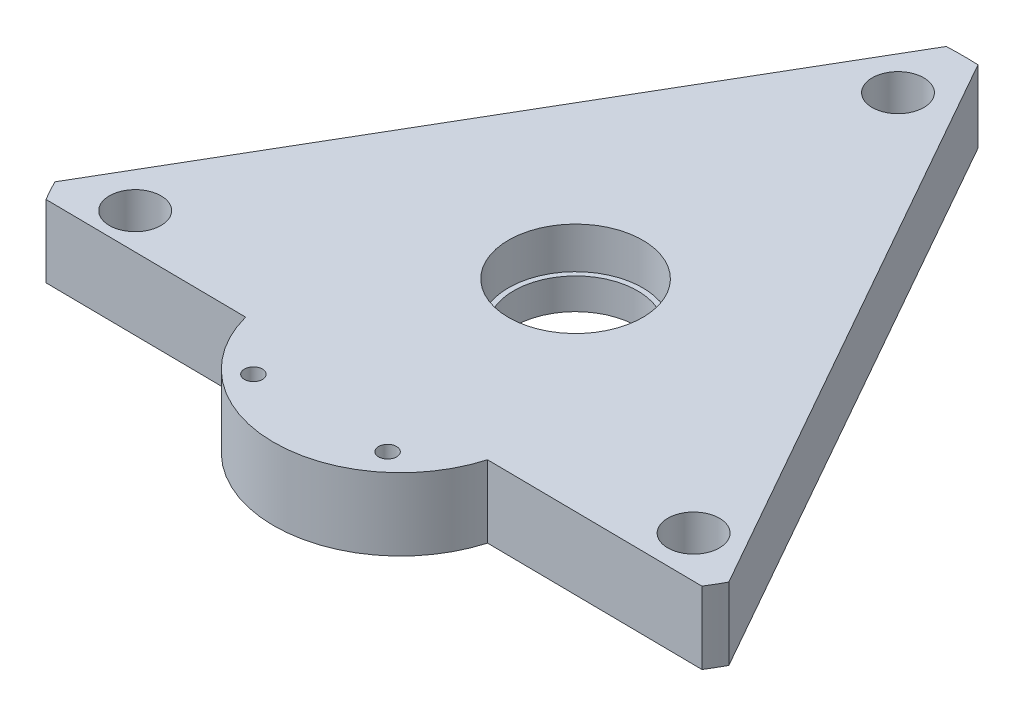
ISO-10303-21;
HEADER;
FILE_DESCRIPTION(('STEP AP214'),'2;1');
FILE_NAME('part.step','',(''),(''),'','','');
FILE_SCHEMA(('AUTOMOTIVE_DESIGN { 1 0 10303 214 1 1 1 1 }'));
ENDSEC;
DATA;
#1=APPLICATION_CONTEXT('core data for automotive mechanical design processes');
#2=APPLICATION_PROTOCOL_DEFINITION('international standard','automotive_design',2000,#1);
#3=PRODUCT_CONTEXT('',#1,'mechanical');
#4=PRODUCT('Part','Part','',(#3));
#5=PRODUCT_RELATED_PRODUCT_CATEGORY('part','',(#4));
#6=PRODUCT_DEFINITION_FORMATION('','',#4);
#7=PRODUCT_DEFINITION_CONTEXT('part definition',#1,'design');
#8=PRODUCT_DEFINITION('design','',#6,#7);
#9=PRODUCT_DEFINITION_SHAPE('','',#8);
#10=(LENGTH_UNIT() NAMED_UNIT(*) SI_UNIT(.MILLI.,.METRE.));
#11=(NAMED_UNIT(*) PLANE_ANGLE_UNIT() SI_UNIT($,.RADIAN.));
#12=(NAMED_UNIT(*) SI_UNIT($,.STERADIAN.) SOLID_ANGLE_UNIT());
#13=UNCERTAINTY_MEASURE_WITH_UNIT(LENGTH_MEASURE(1.E-05),#10,'distance_accuracy_value','');
#14=(GEOMETRIC_REPRESENTATION_CONTEXT(3) GLOBAL_UNCERTAINTY_ASSIGNED_CONTEXT((#13)) GLOBAL_UNIT_ASSIGNED_CONTEXT((#10,
#11,#12)) REPRESENTATION_CONTEXT('',''));
#15=CARTESIAN_POINT('',(0.,0.,0.));
#16=DIRECTION('',(0.,0.,1.));
#17=DIRECTION('',(1.,0.,0.));
#18=AXIS2_PLACEMENT_3D('',#15,#16,#17);
#19=CARTESIAN_POINT('',(0.,14.,0.));
#20=DIRECTION('',(0.,-1.,0.));
#21=DIRECTION('',(0.,0.,-1.));
#22=AXIS2_PLACEMENT_3D('',#19,#20,#21);
#23=CYLINDRICAL_SURFACE('',#22,75.);
#24=CARTESIAN_POINT('',(0.,0.,0.));
#25=DIRECTION('',(0.,1.,0.));
#26=DIRECTION('',(0.,0.,1.));
#27=AXIS2_PLACEMENT_3D('',#24,#25,#26);
#28=CIRCLE('',#27,75.);
#29=CARTESIAN_POINT('',(-66.7510841165023,0.,34.1949231505445));
#30=VERTEX_POINT('',#29);
#31=CARTESIAN_POINT('',(-64.6552196985324,0.,38.009243161822));
#32=VERTEX_POINT('',#31);
#33=EDGE_CURVE('E125',#30,#32,#28,.T.);
#34=ORIENTED_EDGE('',*,*,#33,.T.);
#35=DIRECTION('',(0.,-1.,0.));
#36=VECTOR('',#35,1.);
#37=CARTESIAN_POINT('',(-64.6552196985324,15.,38.009243161822));
#38=LINE('',#37,#36);
#39=CARTESIAN_POINT('',(-64.6552196985324,14.,38.009243161822));
#40=VERTEX_POINT('',#39);
#41=EDGE_CURVE('E196',#40,#32,#38,.T.);
#42=ORIENTED_EDGE('',*,*,#41,.F.);
#43=CARTESIAN_POINT('',(0.,14.,0.));
#44=DIRECTION('',(0.,1.,0.));
#45=DIRECTION('',(0.,0.,1.));
#46=AXIS2_PLACEMENT_3D('',#43,#44,#45);
#47=CIRCLE('',#46,75.);
#48=CARTESIAN_POINT('',(-66.7510841165023,14.,34.1949231505445));
#49=VERTEX_POINT('',#48);
#50=EDGE_CURVE('E45',#49,#40,#47,.T.);
#51=ORIENTED_EDGE('',*,*,#50,.F.);
#52=DIRECTION('',(0.,-1.,0.));
#53=VECTOR('',#52,1.);
#54=CARTESIAN_POINT('',(-66.7510841165023,15.,34.1949231505445));
#55=LINE('',#54,#53);
#56=EDGE_CURVE('E186',#49,#30,#55,.T.);
#57=ORIENTED_EDGE('',*,*,#56,.T.);
#58=EDGE_LOOP('',(#34,#42,#51,#57));
#59=FACE_BOUND('',#58,.T.);
#60=ADVANCED_FACE('F36',(#59),#23,.T.);
#61=CARTESIAN_POINT('',(63.846861252916,14.,39.3519797234002));
#62=VERTEX_POINT('',#61);
#63=CARTESIAN_POINT('',(65.762802754264,14.,36.0590317937651));
#64=VERTEX_POINT('',#63);
#65=EDGE_CURVE('E11',#62,#64,#47,.T.);
#66=ORIENTED_EDGE('',*,*,#65,.F.);
#67=DIRECTION('',(0.,-1.,0.));
#68=VECTOR('',#67,1.);
#69=CARTESIAN_POINT('',(63.846861252916,15.,39.3519797234002));
#70=LINE('',#69,#68);
#71=CARTESIAN_POINT('',(63.846861252916,0.,39.3519797234002));
#72=VERTEX_POINT('',#71);
#73=EDGE_CURVE('E192',#62,#72,#70,.T.);
#74=ORIENTED_EDGE('',*,*,#73,.T.);
#75=CARTESIAN_POINT('',(65.762802754264,0.,36.0590317937651));
#76=VERTEX_POINT('',#75);
#77=EDGE_CURVE('E39',#72,#76,#28,.T.);
#78=ORIENTED_EDGE('',*,*,#77,.T.);
#79=DIRECTION('',(0.,-1.,0.));
#80=VECTOR('',#79,1.);
#81=CARTESIAN_POINT('',(65.762802754264,15.,36.0590317937651));
#82=LINE('',#81,#80);
#83=EDGE_CURVE('E108',#64,#76,#82,.T.);
#84=ORIENTED_EDGE('',*,*,#83,.F.);
#85=EDGE_LOOP('',(#66,#74,#78,#84));
#86=FACE_BOUND('',#85,.T.);
#87=ADVANCED_FACE('F210',(#86),#23,.T.);
#88=DIRECTION('',(0.,-1.,0.));
#89=VECTOR('',#88,1.);
#90=CARTESIAN_POINT('',(3.0730268676745,15.,-74.9370169266869));
#91=LINE('',#90,#89);
#92=CARTESIAN_POINT('',(3.0730268676745,14.,-74.9370169266869));
#93=VERTEX_POINT('',#92);
#94=CARTESIAN_POINT('',(3.0730268676745,0.,-74.9370169266869));
#95=VERTEX_POINT('',#94);
#96=EDGE_CURVE('E105',#93,#95,#91,.T.);
#97=ORIENTED_EDGE('',*,*,#96,.T.);
#98=CARTESIAN_POINT('',(-3.07302686766589,0.,-74.9370169266872));
#99=VERTEX_POINT('',#98);
#100=EDGE_CURVE('E119',#95,#99,#28,.T.);
#101=ORIENTED_EDGE('',*,*,#100,.T.);
#102=DIRECTION('',(0.,-1.,0.));
#103=VECTOR('',#102,1.);
#104=CARTESIAN_POINT('',(-3.07302686766588,15.,-74.9370169266872));
#105=LINE('',#104,#103);
#106=CARTESIAN_POINT('',(-3.07302686766588,14.,-74.9370169266872));
#107=VERTEX_POINT('',#106);
#108=EDGE_CURVE('E60',#107,#99,#105,.T.);
#109=ORIENTED_EDGE('',*,*,#108,.F.);
#110=EDGE_CURVE('E44',#93,#107,#47,.T.);
#111=ORIENTED_EDGE('',*,*,#110,.F.);
#112=EDGE_LOOP('',(#97,#101,#109,#111));
#113=FACE_BOUND('',#112,.T.);
#114=ADVANCED_FACE('F118',(#113),#23,.T.);
#115=CARTESIAN_POINT('',(0.,14.,0.));
#116=DIRECTION('',(0.,1.,0.));
#117=DIRECTION('',(0.,0.,1.));
#118=AXIS2_PLACEMENT_3D('',#115,#116,#117);
#119=PLANE('',#118);
#120=DIRECTION('',(-0.999945412180076,0.,-0.0104485721521024));
#121=VECTOR('',#120,1.);
#122=CARTESIAN_POINT('',(-0.404179222808193,14.,38.6806114426111));
#123=LINE('',#122,#121);
#124=CARTESIAN_POINT('',(-25.5469135202589,14.,38.4178914278902));
#125=VERTEX_POINT('',#124);
#126=EDGE_CURVE('E178',#125,#40,#123,.T.);
#127=ORIENTED_EDGE('',*,*,#126,.F.);
#128=CARTESIAN_POINT('',(-1.78311700332361,14.,32.1469317711742));
#129=DIRECTION('',(0.,1.,0.));
#130=DIRECTION('',(0.,0.,1.));
#131=AXIS2_PLACEMENT_3D('',#128,#129,#130);
#132=CIRCLE('',#131,24.577285446413);
#133=CARTESIAN_POINT('',(21.8444528044527,14.,38.9130905701623));
#134=VERTEX_POINT('',#133);
#135=EDGE_CURVE('E173',#125,#134,#132,.T.);
#136=ORIENTED_EDGE('',*,*,#135,.T.);
#137=DIRECTION('',(-0.999945412180076,0.,-0.0104485721521024));
#138=VECTOR('',#137,1.);
#139=CARTESIAN_POINT('',(-0.404179222808193,14.,38.6806114426111));
#140=LINE('',#139,#138);
#141=EDGE_CURVE('E180',#62,#134,#140,.T.);
#142=ORIENTED_EDGE('',*,*,#141,.F.);
#143=ORIENTED_EDGE('',*,*,#65,.T.);
#144=DIRECTION('',(-0.491777082684444,0.,-0.870721138451558));
#145=VECTOR('',#144,1.);
#146=CARTESIAN_POINT('',(34.4179148109693,14.,-19.4389925664609));
#147=LINE('',#146,#145);
#148=EDGE_CURVE('E182',#64,#93,#147,.T.);
#149=ORIENTED_EDGE('',*,*,#148,.T.);
#150=ORIENTED_EDGE('',*,*,#110,.T.);
#151=DIRECTION('',(0.503975889205033,0.,-0.863717721886032));
#152=VECTOR('',#151,1.);
#153=CARTESIAN_POINT('',(-34.9120554920841,14.,-20.3710468880714));
#154=LINE('',#153,#152);
#155=EDGE_CURVE('E184',#49,#107,#154,.T.);
#156=ORIENTED_EDGE('',*,*,#155,.F.);
#157=ORIENTED_EDGE('',*,*,#50,.T.);
#158=EDGE_LOOP('',(#127,#136,#142,#143,#149,#150,#156,#157));
#159=FACE_BOUND('',#158,.T.);
#160=CARTESIAN_POINT('',(10.7983657553551,14.,47.2506615839935));
#161=DIRECTION('',(0.,1.,0.));
#162=DIRECTION('',(0.,0.,1.));
#163=AXIS2_PLACEMENT_3D('',#160,#161,#162);
#164=CIRCLE('',#163,1.75);
#165=CARTESIAN_POINT('',(10.7983657553551,14.,49.0006615839935));
#166=VERTEX_POINT('',#165);
#167=EDGE_CURVE('E170',#166,#166,#164,.T.);
#168=ORIENTED_EDGE('',*,*,#167,.F.);
#169=EDGE_LOOP('',(#168));
#170=FACE_BOUND('',#169,.T.);
#171=CARTESIAN_POINT('',(-15.201634244645,14.,47.2506615839935));
#172=DIRECTION('',(0.,1.,0.));
#173=DIRECTION('',(0.,0.,1.));
#174=AXIS2_PLACEMENT_3D('',#171,#172,#173);
#175=CIRCLE('',#174,1.75);
#176=CARTESIAN_POINT('',(-15.201634244645,14.,49.0006615839935));
#177=VERTEX_POINT('',#176);
#178=EDGE_CURVE('E164',#177,#177,#175,.T.);
#179=ORIENTED_EDGE('',*,*,#178,.F.);
#180=EDGE_LOOP('',(#179));
#181=FACE_BOUND('',#180,.T.);
#182=CARTESIAN_POINT('',(-54.1265877365273,14.,31.2500000000003));
#183=DIRECTION('',(0.,1.,0.));
#184=DIRECTION('',(0.,0.,1.));
#185=AXIS2_PLACEMENT_3D('',#182,#183,#184);
#186=CIRCLE('',#185,4.99999999999999);
#187=CARTESIAN_POINT('',(-54.1265877365273,14.,36.2500000000003));
#188=VERTEX_POINT('',#187);
#189=EDGE_CURVE('E158',#188,#188,#186,.T.);
#190=ORIENTED_EDGE('',*,*,#189,.F.);
#191=EDGE_LOOP('',(#190));
#192=FACE_BOUND('',#191,.T.);
#193=CARTESIAN_POINT('',(54.1265877365273,14.,31.2500000000003));
#194=DIRECTION('',(0.,1.,0.));
#195=DIRECTION('',(0.,0.,1.));
#196=AXIS2_PLACEMENT_3D('',#193,#194,#195);
#197=CIRCLE('',#196,5.);
#198=CARTESIAN_POINT('',(54.1265877365273,14.,36.2500000000003));
#199=VERTEX_POINT('',#198);
#200=EDGE_CURVE('E152',#199,#199,#197,.T.);
#201=ORIENTED_EDGE('',*,*,#200,.F.);
#202=EDGE_LOOP('',(#201));
#203=FACE_BOUND('',#202,.T.);
#204=CARTESIAN_POINT('',(0.,14.,-62.5));
#205=DIRECTION('',(0.,1.,0.));
#206=DIRECTION('',(0.,0.,1.));
#207=AXIS2_PLACEMENT_3D('',#204,#205,#206);
#208=CIRCLE('',#207,5.);
#209=CARTESIAN_POINT('',(0.,14.,-57.5));
#210=VERTEX_POINT('',#209);
#211=EDGE_CURVE('E146',#210,#210,#208,.T.);
#212=ORIENTED_EDGE('',*,*,#211,.F.);
#213=EDGE_LOOP('',(#212));
#214=FACE_BOUND('',#213,.T.);
#215=CARTESIAN_POINT('',(0.,14.,0.));
#216=DIRECTION('',(0.,1.,0.));
#217=DIRECTION('',(0.,0.,1.));
#218=AXIS2_PLACEMENT_3D('',#215,#216,#217);
#219=CIRCLE('',#218,13.);
#220=CARTESIAN_POINT('',(0.,14.,13.));
#221=VERTEX_POINT('',#220);
#222=EDGE_CURVE('E132',#221,#221,#219,.T.);
#223=ORIENTED_EDGE('',*,*,#222,.F.);
#224=EDGE_LOOP('',(#223));
#225=FACE_BOUND('',#224,.T.);
#226=ADVANCED_FACE('F213',(#159,#170,#181,#192,#203,#214,#225),#119,.T.);
#227=CARTESIAN_POINT('',(0.,0.,0.));
#228=DIRECTION('',(0.,1.,0.));
#229=DIRECTION('',(0.,0.,1.));
#230=AXIS2_PLACEMENT_3D('',#227,#228,#229);
#231=PLANE('',#230);
#232=CARTESIAN_POINT('',(0.,0.,0.));
#233=DIRECTION('',(0.,1.,0.));
#234=DIRECTION('',(0.,0.,1.));
#235=AXIS2_PLACEMENT_3D('',#232,#233,#234);
#236=CIRCLE('',#235,12.);
#237=CARTESIAN_POINT('',(0.,0.,12.));
#238=VERTEX_POINT('',#237);
#239=EDGE_CURVE('E137',#238,#238,#236,.T.);
#240=ORIENTED_EDGE('',*,*,#239,.T.);
#241=EDGE_LOOP('',(#240));
#242=FACE_BOUND('',#241,.T.);
#243=CARTESIAN_POINT('',(0.,0.,-62.5));
#244=DIRECTION('',(0.,1.,0.));
#245=DIRECTION('',(0.,0.,1.));
#246=AXIS2_PLACEMENT_3D('',#243,#244,#245);
#247=CIRCLE('',#246,5.);
#248=CARTESIAN_POINT('',(0.,0.,-57.5));
#249=VERTEX_POINT('',#248);
#250=EDGE_CURVE('E145',#249,#249,#247,.T.);
#251=ORIENTED_EDGE('',*,*,#250,.T.);
#252=EDGE_LOOP('',(#251));
#253=FACE_BOUND('',#252,.T.);
#254=CARTESIAN_POINT('',(54.1265877365273,0.,31.2500000000003));
#255=DIRECTION('',(0.,1.,0.));
#256=DIRECTION('',(0.,0.,1.));
#257=AXIS2_PLACEMENT_3D('',#254,#255,#256);
#258=CIRCLE('',#257,5.);
#259=CARTESIAN_POINT('',(54.1265877365273,0.,36.2500000000003));
#260=VERTEX_POINT('',#259);
#261=EDGE_CURVE('E149',#260,#260,#258,.T.);
#262=ORIENTED_EDGE('',*,*,#261,.T.);
#263=EDGE_LOOP('',(#262));
#264=FACE_BOUND('',#263,.T.);
#265=CARTESIAN_POINT('',(-54.1265877365273,0.,31.2500000000003));
#266=DIRECTION('',(0.,1.,0.));
#267=DIRECTION('',(0.,0.,1.));
#268=AXIS2_PLACEMENT_3D('',#265,#266,#267);
#269=CIRCLE('',#268,4.99999999999999);
#270=CARTESIAN_POINT('',(-54.1265877365273,0.,36.2500000000003));
#271=VERTEX_POINT('',#270);
#272=EDGE_CURVE('E155',#271,#271,#269,.T.);
#273=ORIENTED_EDGE('',*,*,#272,.T.);
#274=EDGE_LOOP('',(#273));
#275=FACE_BOUND('',#274,.T.);
#276=CARTESIAN_POINT('',(-15.201634244645,0.,47.2506615839935));
#277=DIRECTION('',(0.,1.,0.));
#278=DIRECTION('',(0.,0.,1.));
#279=AXIS2_PLACEMENT_3D('',#276,#277,#278);
#280=CIRCLE('',#279,1.75);
#281=CARTESIAN_POINT('',(-15.201634244645,0.,49.0006615839935));
#282=VERTEX_POINT('',#281);
#283=EDGE_CURVE('E161',#282,#282,#280,.T.);
#284=ORIENTED_EDGE('',*,*,#283,.T.);
#285=EDGE_LOOP('',(#284));
#286=FACE_BOUND('',#285,.T.);
#287=CARTESIAN_POINT('',(10.7983657553551,0.,47.2506615839935));
#288=DIRECTION('',(0.,1.,0.));
#289=DIRECTION('',(0.,0.,1.));
#290=AXIS2_PLACEMENT_3D('',#287,#288,#289);
#291=CIRCLE('',#290,1.75);
#292=CARTESIAN_POINT('',(10.7983657553551,0.,49.0006615839935));
#293=VERTEX_POINT('',#292);
#294=EDGE_CURVE('E167',#293,#293,#291,.T.);
#295=ORIENTED_EDGE('',*,*,#294,.T.);
#296=EDGE_LOOP('',(#295));
#297=FACE_BOUND('',#296,.T.);
#298=CARTESIAN_POINT('',(-1.78311700332361,0.,32.1469317711742));
#299=DIRECTION('',(0.,-1.,0.));
#300=DIRECTION('',(0.,0.,-1.));
#301=AXIS2_PLACEMENT_3D('',#298,#299,#300);
#302=CIRCLE('',#301,24.577285446413);
#303=CARTESIAN_POINT('',(21.8444528044527,0.,38.9130905701623));
#304=VERTEX_POINT('',#303);
#305=CARTESIAN_POINT('',(-25.5469135202589,0.,38.4178914278902));
#306=VERTEX_POINT('',#305);
#307=EDGE_CURVE('E52',#304,#306,#302,.T.);
#308=ORIENTED_EDGE('',*,*,#307,.T.);
#309=DIRECTION('',(0.999945412180076,0.,0.0104485721521024));
#310=VECTOR('',#309,1.);
#311=CARTESIAN_POINT('',(-0.404179222808193,0.,38.6806114426111));
#312=LINE('',#311,#310);
#313=EDGE_CURVE('E193',#32,#306,#312,.T.);
#314=ORIENTED_EDGE('',*,*,#313,.F.);
#315=ORIENTED_EDGE('',*,*,#33,.F.);
#316=DIRECTION('',(-0.503975889205033,0.,0.863717721886031));
#317=VECTOR('',#316,1.);
#318=CARTESIAN_POINT('',(-34.9120554920841,0.,-20.3710468880714));
#319=LINE('',#318,#317);
#320=EDGE_CURVE('E124',#99,#30,#319,.T.);
#321=ORIENTED_EDGE('',*,*,#320,.F.);
#322=ORIENTED_EDGE('',*,*,#100,.F.);
#323=DIRECTION('',(0.491777082684444,0.,0.870721138451558));
#324=VECTOR('',#323,1.);
#325=CARTESIAN_POINT('',(34.4179148109693,0.,-19.4389925664609));
#326=LINE('',#325,#324);
#327=EDGE_CURVE('E102',#95,#76,#326,.T.);
#328=ORIENTED_EDGE('',*,*,#327,.T.);
#329=ORIENTED_EDGE('',*,*,#77,.F.);
#330=EDGE_CURVE('E199',#304,#72,#312,.T.);
#331=ORIENTED_EDGE('',*,*,#330,.F.);
#332=EDGE_LOOP('',(#308,#314,#315,#321,#322,#328,#329,#331));
#333=FACE_BOUND('',#332,.T.);
#334=ADVANCED_FACE('F122',(#242,#253,#264,#275,#286,#297,#333),#231,.F.);
#335=CARTESIAN_POINT('',(0.,6.,0.));
#336=DIRECTION('',(0.,1.,0.));
#337=DIRECTION('',(0.,0.,1.));
#338=AXIS2_PLACEMENT_3D('',#335,#336,#337);
#339=CYLINDRICAL_SURFACE('',#338,13.);
#340=CARTESIAN_POINT('',(0.,6.,0.));
#341=DIRECTION('',(0.,1.,0.));
#342=DIRECTION('',(0.,0.,1.));
#343=AXIS2_PLACEMENT_3D('',#340,#341,#342);
#344=CIRCLE('',#343,13.);
#345=CARTESIAN_POINT('',(0.,6.,13.));
#346=VERTEX_POINT('',#345);
#347=EDGE_CURVE('E127',#346,#346,#344,.T.);
#348=ORIENTED_EDGE('',*,*,#347,.F.);
#349=EDGE_LOOP('',(#348));
#350=FACE_BOUND('',#349,.T.);
#351=ORIENTED_EDGE('',*,*,#222,.T.);
#352=EDGE_LOOP('',(#351));
#353=FACE_BOUND('',#352,.T.);
#354=ADVANCED_FACE('F247',(#350,#353),#339,.F.);
#355=CARTESIAN_POINT('',(0.,6.,0.));
#356=DIRECTION('',(0.,1.,0.));
#357=DIRECTION('',(0.,0.,1.));
#358=AXIS2_PLACEMENT_3D('',#355,#356,#357);
#359=PLANE('',#358);
#360=CARTESIAN_POINT('',(0.,6.,0.));
#361=DIRECTION('',(0.,1.,0.));
#362=DIRECTION('',(0.,0.,1.));
#363=AXIS2_PLACEMENT_3D('',#360,#361,#362);
#364=CIRCLE('',#363,12.);
#365=CARTESIAN_POINT('',(0.,6.,12.));
#366=VERTEX_POINT('',#365);
#367=EDGE_CURVE('E142',#366,#366,#364,.T.);
#368=ORIENTED_EDGE('',*,*,#367,.F.);
#369=EDGE_LOOP('',(#368));
#370=FACE_BOUND('',#369,.T.);
#371=ORIENTED_EDGE('',*,*,#347,.T.);
#372=EDGE_LOOP('',(#371));
#373=FACE_BOUND('',#372,.T.);
#374=ADVANCED_FACE('F252',(#370,#373),#359,.T.);
#375=CARTESIAN_POINT('',(0.,-2.,0.));
#376=DIRECTION('',(0.,1.,0.));
#377=DIRECTION('',(0.,0.,1.));
#378=AXIS2_PLACEMENT_3D('',#375,#376,#377);
#379=CYLINDRICAL_SURFACE('',#378,12.);
#380=ORIENTED_EDGE('',*,*,#367,.T.);
#381=EDGE_LOOP('',(#380));
#382=FACE_BOUND('',#381,.T.);
#383=ORIENTED_EDGE('',*,*,#239,.F.);
#384=EDGE_LOOP('',(#383));
#385=FACE_BOUND('',#384,.T.);
#386=ADVANCED_FACE('F256',(#382,#385),#379,.F.);
#387=CARTESIAN_POINT('',(0.,0.,-62.5));
#388=DIRECTION('',(0.,1.,0.));
#389=DIRECTION('',(0.,0.,1.));
#390=AXIS2_PLACEMENT_3D('',#387,#388,#389);
#391=CYLINDRICAL_SURFACE('',#390,5.);
#392=ORIENTED_EDGE('',*,*,#250,.F.);
#393=EDGE_LOOP('',(#392));
#394=FACE_BOUND('',#393,.T.);
#395=ORIENTED_EDGE('',*,*,#211,.T.);
#396=EDGE_LOOP('',(#395));
#397=FACE_BOUND('',#396,.T.);
#398=ADVANCED_FACE('F260',(#394,#397),#391,.F.);
#399=CARTESIAN_POINT('',(54.1265877365273,0.,31.2500000000003));
#400=DIRECTION('',(0.,1.,0.));
#401=DIRECTION('',(0.,0.,1.));
#402=AXIS2_PLACEMENT_3D('',#399,#400,#401);
#403=CYLINDRICAL_SURFACE('',#402,5.);
#404=ORIENTED_EDGE('',*,*,#261,.F.);
#405=EDGE_LOOP('',(#404));
#406=FACE_BOUND('',#405,.T.);
#407=ORIENTED_EDGE('',*,*,#200,.T.);
#408=EDGE_LOOP('',(#407));
#409=FACE_BOUND('',#408,.T.);
#410=ADVANCED_FACE('F264',(#406,#409),#403,.F.);
#411=CARTESIAN_POINT('',(-54.1265877365273,0.,31.2500000000003));
#412=DIRECTION('',(0.,1.,0.));
#413=DIRECTION('',(0.,0.,1.));
#414=AXIS2_PLACEMENT_3D('',#411,#412,#413);
#415=CYLINDRICAL_SURFACE('',#414,4.99999999999999);
#416=ORIENTED_EDGE('',*,*,#272,.F.);
#417=EDGE_LOOP('',(#416));
#418=FACE_BOUND('',#417,.T.);
#419=ORIENTED_EDGE('',*,*,#189,.T.);
#420=EDGE_LOOP('',(#419));
#421=FACE_BOUND('',#420,.T.);
#422=ADVANCED_FACE('F268',(#418,#421),#415,.F.);
#423=CARTESIAN_POINT('',(-15.201634244645,0.,47.2506615839935));
#424=DIRECTION('',(0.,1.,0.));
#425=DIRECTION('',(0.,0.,1.));
#426=AXIS2_PLACEMENT_3D('',#423,#424,#425);
#427=CYLINDRICAL_SURFACE('',#426,1.75);
#428=ORIENTED_EDGE('',*,*,#283,.F.);
#429=EDGE_LOOP('',(#428));
#430=FACE_BOUND('',#429,.T.);
#431=ORIENTED_EDGE('',*,*,#178,.T.);
#432=EDGE_LOOP('',(#431));
#433=FACE_BOUND('',#432,.T.);
#434=ADVANCED_FACE('F231',(#430,#433),#427,.F.);
#435=CARTESIAN_POINT('',(10.7983657553551,0.,47.2506615839935));
#436=DIRECTION('',(0.,1.,0.));
#437=DIRECTION('',(0.,0.,1.));
#438=AXIS2_PLACEMENT_3D('',#435,#436,#437);
#439=CYLINDRICAL_SURFACE('',#438,1.75);
#440=ORIENTED_EDGE('',*,*,#294,.F.);
#441=EDGE_LOOP('',(#440));
#442=FACE_BOUND('',#441,.T.);
#443=ORIENTED_EDGE('',*,*,#167,.T.);
#444=EDGE_LOOP('',(#443));
#445=FACE_BOUND('',#444,.T.);
#446=ADVANCED_FACE('F224',(#442,#445),#439,.F.);
#447=CARTESIAN_POINT('',(-34.9120554920841,15.,-20.3710468880714));
#448=DIRECTION('',(0.863717721886031,0.,0.503975889205033));
#449=DIRECTION('',(0.503975889205033,0.,-0.863717721886032));
#450=AXIS2_PLACEMENT_3D('',#447,#448,#449);
#451=PLANE('',#450);
#452=ORIENTED_EDGE('',*,*,#155,.T.);
#453=ORIENTED_EDGE('',*,*,#108,.T.);
#454=ORIENTED_EDGE('',*,*,#320,.T.);
#455=ORIENTED_EDGE('',*,*,#56,.F.);
#456=EDGE_LOOP('',(#452,#453,#454,#455));
#457=FACE_BOUND('',#456,.T.);
#458=ADVANCED_FACE('F222',(#457),#451,.F.);
#459=CARTESIAN_POINT('',(34.4179148109693,15.,-19.4389925664609));
#460=DIRECTION('',(0.870721138451558,0.,-0.491777082684444));
#461=DIRECTION('',(-0.491777082684444,0.,-0.870721138451558));
#462=AXIS2_PLACEMENT_3D('',#459,#460,#461);
#463=PLANE('',#462);
#464=ORIENTED_EDGE('',*,*,#83,.T.);
#465=ORIENTED_EDGE('',*,*,#327,.F.);
#466=ORIENTED_EDGE('',*,*,#96,.F.);
#467=ORIENTED_EDGE('',*,*,#148,.F.);
#468=EDGE_LOOP('',(#464,#465,#466,#467));
#469=FACE_BOUND('',#468,.T.);
#470=ADVANCED_FACE('F104',(#469),#463,.T.);
#471=CARTESIAN_POINT('',(-1.78311700332361,15.,32.1469317711742));
#472=DIRECTION('',(0.,-1.,0.));
#473=DIRECTION('',(0.,0.,-1.));
#474=AXIS2_PLACEMENT_3D('',#471,#472,#473);
#475=CYLINDRICAL_SURFACE('',#474,24.577285446413);
#476=DIRECTION('',(0.,-1.,0.));
#477=VECTOR('',#476,1.);
#478=CARTESIAN_POINT('',(-25.5469135202589,15.,38.4178914278902));
#479=LINE('',#478,#477);
#480=EDGE_CURVE('E113',#125,#306,#479,.T.);
#481=ORIENTED_EDGE('',*,*,#480,.T.);
#482=ORIENTED_EDGE('',*,*,#307,.F.);
#483=DIRECTION('',(0.,-1.,0.));
#484=VECTOR('',#483,1.);
#485=CARTESIAN_POINT('',(21.8444528044527,15.,38.9130905701623));
#486=LINE('',#485,#484);
#487=EDGE_CURVE('E190',#134,#304,#486,.T.);
#488=ORIENTED_EDGE('',*,*,#487,.F.);
#489=ORIENTED_EDGE('',*,*,#135,.F.);
#490=EDGE_LOOP('',(#481,#482,#488,#489));
#491=FACE_BOUND('',#490,.T.);
#492=ADVANCED_FACE('F215',(#491),#475,.T.);
#493=CARTESIAN_POINT('',(-0.404179222808193,15.,38.6806114426111));
#494=DIRECTION('',(0.0104485721521024,0.,-0.999945412180076));
#495=DIRECTION('',(-0.999945412180076,0.,-0.0104485721521024));
#496=AXIS2_PLACEMENT_3D('',#493,#494,#495);
#497=PLANE('',#496);
#498=ORIENTED_EDGE('',*,*,#126,.T.);
#499=ORIENTED_EDGE('',*,*,#41,.T.);
#500=ORIENTED_EDGE('',*,*,#313,.T.);
#501=ORIENTED_EDGE('',*,*,#480,.F.);
#502=EDGE_LOOP('',(#498,#499,#500,#501));
#503=FACE_BOUND('',#502,.T.);
#504=ADVANCED_FACE('F218',(#503),#497,.F.);
#505=ORIENTED_EDGE('',*,*,#141,.T.);
#506=ORIENTED_EDGE('',*,*,#487,.T.);
#507=ORIENTED_EDGE('',*,*,#330,.T.);
#508=ORIENTED_EDGE('',*,*,#73,.F.);
#509=EDGE_LOOP('',(#505,#506,#507,#508));
#510=FACE_BOUND('',#509,.T.);
#511=ADVANCED_FACE('F206',(#510),#497,.F.);
#512=CLOSED_SHELL('',(#60,#87,#114,#226,#334,#354,#374,#386,#398,#410,#422,#434,#446,#458,#470,
#492,#504,#511));
#513=MANIFOLD_SOLID_BREP('B2',#512);
#514=ADVANCED_BREP_SHAPE_REPRESENTATION('',(#18,#513),#14);
#515=SHAPE_DEFINITION_REPRESENTATION(#9,#514);
ENDSEC;
END-ISO-10303-21;
